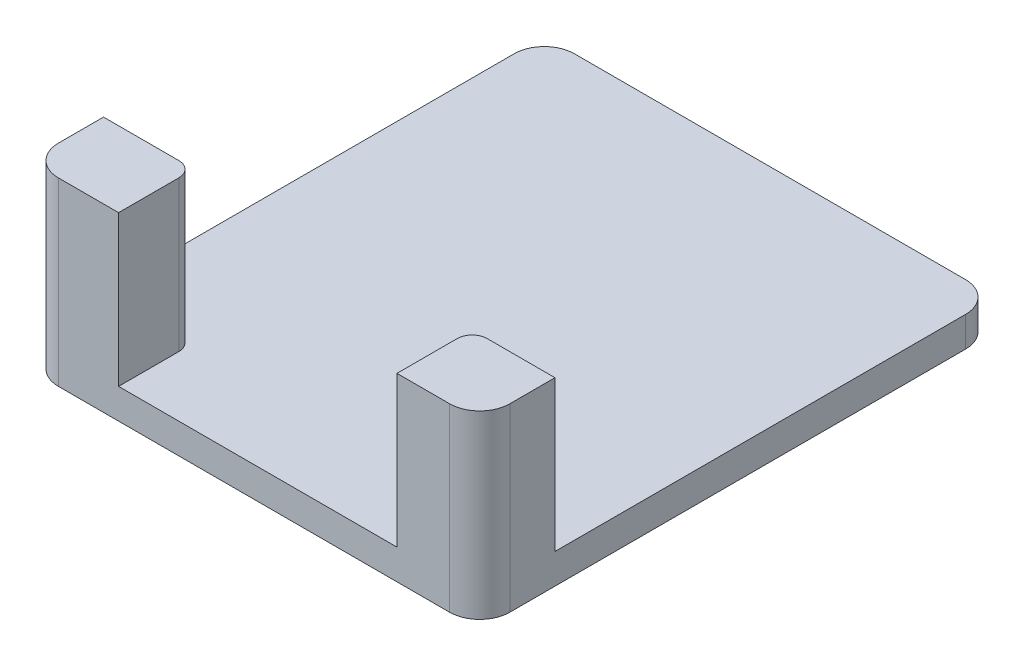
ISO-10303-21;
HEADER;
FILE_DESCRIPTION(('STEP AP214'),'2;1');
FILE_NAME('part.step','',(''),(''),'','','');
FILE_SCHEMA(('AUTOMOTIVE_DESIGN { 1 0 10303 214 1 1 1 1 }'));
ENDSEC;
DATA;
#1=APPLICATION_CONTEXT('core data for automotive mechanical design processes');
#2=APPLICATION_PROTOCOL_DEFINITION('international standard','automotive_design',2000,#1);
#3=PRODUCT_CONTEXT('',#1,'mechanical');
#4=PRODUCT('Part','Part','',(#3));
#5=PRODUCT_RELATED_PRODUCT_CATEGORY('part','',(#4));
#6=PRODUCT_DEFINITION_FORMATION('','',#4);
#7=PRODUCT_DEFINITION_CONTEXT('part definition',#1,'design');
#8=PRODUCT_DEFINITION('design','',#6,#7);
#9=PRODUCT_DEFINITION_SHAPE('','',#8);
#10=(LENGTH_UNIT() NAMED_UNIT(*) SI_UNIT(.MILLI.,.METRE.));
#11=(NAMED_UNIT(*) PLANE_ANGLE_UNIT() SI_UNIT($,.RADIAN.));
#12=(NAMED_UNIT(*) SI_UNIT($,.STERADIAN.) SOLID_ANGLE_UNIT());
#13=UNCERTAINTY_MEASURE_WITH_UNIT(LENGTH_MEASURE(1.E-05),#10,'distance_accuracy_value','');
#14=(GEOMETRIC_REPRESENTATION_CONTEXT(3) GLOBAL_UNCERTAINTY_ASSIGNED_CONTEXT((#13)) GLOBAL_UNIT_ASSIGNED_CONTEXT((#10,
#11,#12)) REPRESENTATION_CONTEXT('',''));
#15=CARTESIAN_POINT('',(0.,0.,0.));
#16=DIRECTION('',(0.,0.,1.));
#17=DIRECTION('',(1.,0.,0.));
#18=AXIS2_PLACEMENT_3D('',#15,#16,#17);
#19=CARTESIAN_POINT('',(0.,2.,0.));
#20=DIRECTION('',(0.,-1.,0.));
#21=DIRECTION('',(0.,0.,-1.));
#22=AXIS2_PLACEMENT_3D('',#19,#20,#21);
#23=PLANE('',#22);
#24=DIRECTION('',(0.,0.,-1.));
#25=VECTOR('',#24,1.);
#26=CARTESIAN_POINT('',(30.,2.,0.));
#27=LINE('',#26,#25);
#28=CARTESIAN_POINT('',(30.,2.,-5.));
#29=VERTEX_POINT('',#28);
#30=CARTESIAN_POINT('',(30.,2.,-32.29));
#31=VERTEX_POINT('',#30);
#32=EDGE_CURVE('E209',#29,#31,#27,.T.);
#33=ORIENTED_EDGE('',*,*,#32,.T.);
#34=CARTESIAN_POINT('',(28.,2.,-32.29));
#35=DIRECTION('',(0.,-1.,0.));
#36=DIRECTION('',(0.,0.,-1.));
#37=AXIS2_PLACEMENT_3D('',#34,#35,#36);
#38=CIRCLE('',#37,2.);
#39=CARTESIAN_POINT('',(28.,2.,-34.29));
#40=VERTEX_POINT('',#39);
#41=EDGE_CURVE('E244',#31,#40,#38,.F.);
#42=ORIENTED_EDGE('',*,*,#41,.T.);
#43=DIRECTION('',(-1.,0.,0.));
#44=VECTOR('',#43,1.);
#45=CARTESIAN_POINT('',(0.,2.,-34.29));
#46=LINE('',#45,#44);
#47=CARTESIAN_POINT('',(2.,2.,-34.29));
#48=VERTEX_POINT('',#47);
#49=EDGE_CURVE('E212',#40,#48,#46,.T.);
#50=ORIENTED_EDGE('',*,*,#49,.T.);
#51=CARTESIAN_POINT('',(2.,2.,-32.29));
#52=DIRECTION('',(0.,-1.,0.));
#53=DIRECTION('',(0.,0.,-1.));
#54=AXIS2_PLACEMENT_3D('',#51,#52,#53);
#55=CIRCLE('',#54,2.);
#56=CARTESIAN_POINT('',(0.,2.,-32.29));
#57=VERTEX_POINT('',#56);
#58=EDGE_CURVE('E242',#48,#57,#55,.F.);
#59=ORIENTED_EDGE('',*,*,#58,.T.);
#60=DIRECTION('',(0.,0.,1.));
#61=VECTOR('',#60,1.);
#62=CARTESIAN_POINT('',(0.,2.,0.));
#63=LINE('',#62,#61);
#64=CARTESIAN_POINT('',(0.,2.,-5.));
#65=VERTEX_POINT('',#64);
#66=EDGE_CURVE('E204',#57,#65,#63,.T.);
#67=ORIENTED_EDGE('',*,*,#66,.T.);
#68=DIRECTION('',(-1.,0.,0.));
#69=VECTOR('',#68,1.);
#70=CARTESIAN_POINT('',(0.,2.,-5.));
#71=LINE('',#70,#69);
#72=CARTESIAN_POINT('',(5.,2.,-5.));
#73=VERTEX_POINT('',#72);
#74=EDGE_CURVE('E182',#73,#65,#71,.T.);
#75=ORIENTED_EDGE('',*,*,#74,.F.);
#76=CARTESIAN_POINT('',(5.,2.,-4.));
#77=DIRECTION('',(0.,-1.,0.));
#78=DIRECTION('',(0.,0.,-1.));
#79=AXIS2_PLACEMENT_3D('',#76,#77,#78);
#80=CIRCLE('',#79,1.);
#81=CARTESIAN_POINT('',(6.,2.,-4.));
#82=VERTEX_POINT('',#81);
#83=EDGE_CURVE('E41',#73,#82,#80,.T.);
#84=ORIENTED_EDGE('',*,*,#83,.T.);
#85=DIRECTION('',(0.,0.,-1.));
#86=VECTOR('',#85,1.);
#87=CARTESIAN_POINT('',(6.,2.,0.));
#88=LINE('',#87,#86);
#89=CARTESIAN_POINT('',(6.,2.,0.));
#90=VERTEX_POINT('',#89);
#91=EDGE_CURVE('E180',#90,#82,#88,.T.);
#92=ORIENTED_EDGE('',*,*,#91,.F.);
#93=DIRECTION('',(1.,0.,0.));
#94=VECTOR('',#93,1.);
#95=CARTESIAN_POINT('',(0.,2.,0.));
#96=LINE('',#95,#94);
#97=CARTESIAN_POINT('',(24.5,2.,0.));
#98=VERTEX_POINT('',#97);
#99=EDGE_CURVE('E165',#90,#98,#96,.T.);
#100=ORIENTED_EDGE('',*,*,#99,.T.);
#101=DIRECTION('',(0.,0.,1.));
#102=VECTOR('',#101,1.);
#103=CARTESIAN_POINT('',(24.5,2.,0.));
#104=LINE('',#103,#102);
#105=CARTESIAN_POINT('',(24.5,2.,-4.));
#106=VERTEX_POINT('',#105);
#107=EDGE_CURVE('E169',#106,#98,#104,.T.);
#108=ORIENTED_EDGE('',*,*,#107,.F.);
#109=CARTESIAN_POINT('',(25.5,2.,-4.));
#110=DIRECTION('',(0.,-1.,0.));
#111=DIRECTION('',(0.,0.,-1.));
#112=AXIS2_PLACEMENT_3D('',#109,#110,#111);
#113=CIRCLE('',#112,1.);
#114=CARTESIAN_POINT('',(25.5,2.,-5.));
#115=VERTEX_POINT('',#114);
#116=EDGE_CURVE('E11',#106,#115,#113,.T.);
#117=ORIENTED_EDGE('',*,*,#116,.T.);
#118=DIRECTION('',(-1.,0.,0.));
#119=VECTOR('',#118,1.);
#120=CARTESIAN_POINT('',(24.5,2.,-5.));
#121=LINE('',#120,#119);
#122=EDGE_CURVE('E189',#29,#115,#121,.T.);
#123=ORIENTED_EDGE('',*,*,#122,.F.);
#124=EDGE_LOOP('',(#33,#42,#50,#59,#67,#75,#84,#92,#100,#108,#117,#123));
#125=FACE_BOUND('',#124,.T.);
#126=ADVANCED_FACE('F33',(#125),#23,.F.);
#127=CARTESIAN_POINT('',(0.,2.,0.));
#128=DIRECTION('',(1.,0.,0.));
#129=DIRECTION('',(0.,0.,-1.));
#130=AXIS2_PLACEMENT_3D('',#127,#128,#129);
#131=PLANE('',#130);
#132=ORIENTED_EDGE('',*,*,#66,.F.);
#133=DIRECTION('',(0.,-1.,0.));
#134=VECTOR('',#133,1.);
#135=CARTESIAN_POINT('',(0.,2.,-32.29));
#136=LINE('',#135,#134);
#137=CARTESIAN_POINT('',(0.,0.,-32.29));
#138=VERTEX_POINT('',#137);
#139=EDGE_CURVE('E248',#57,#138,#136,.T.);
#140=ORIENTED_EDGE('',*,*,#139,.T.);
#141=DIRECTION('',(0.,0.,1.));
#142=VECTOR('',#141,1.);
#143=CARTESIAN_POINT('',(0.,0.,0.));
#144=LINE('',#143,#142);
#145=CARTESIAN_POINT('',(0.,0.,-2.));
#146=VERTEX_POINT('',#145);
#147=EDGE_CURVE('E203',#138,#146,#144,.T.);
#148=ORIENTED_EDGE('',*,*,#147,.T.);
#149=DIRECTION('',(0.,-1.,0.));
#150=VECTOR('',#149,1.);
#151=CARTESIAN_POINT('',(0.,2.,-2.));
#152=LINE('',#151,#150);
#153=CARTESIAN_POINT('',(0.,12.,-2.));
#154=VERTEX_POINT('',#153);
#155=EDGE_CURVE('E246',#146,#154,#152,.F.);
#156=ORIENTED_EDGE('',*,*,#155,.T.);
#157=DIRECTION('',(0.,0.,1.));
#158=VECTOR('',#157,1.);
#159=CARTESIAN_POINT('',(0.,12.,0.));
#160=LINE('',#159,#158);
#161=CARTESIAN_POINT('',(0.,12.,-5.));
#162=VERTEX_POINT('',#161);
#163=EDGE_CURVE('E157',#162,#154,#160,.T.);
#164=ORIENTED_EDGE('',*,*,#163,.F.);
#165=DIRECTION('',(0.,-1.,0.));
#166=VECTOR('',#165,1.);
#167=CARTESIAN_POINT('',(0.,12.,-5.));
#168=LINE('',#167,#166);
#169=EDGE_CURVE('E170',#162,#65,#168,.T.);
#170=ORIENTED_EDGE('',*,*,#169,.T.);
#171=EDGE_LOOP('',(#132,#140,#148,#156,#164,#170));
#172=FACE_BOUND('',#171,.T.);
#173=ADVANCED_FACE('F280',(#172),#131,.F.);
#174=CARTESIAN_POINT('',(0.,2.,0.));
#175=DIRECTION('',(0.,0.,-1.));
#176=DIRECTION('',(-1.,0.,0.));
#177=AXIS2_PLACEMENT_3D('',#174,#175,#176);
#178=PLANE('',#177);
#179=DIRECTION('',(1.,0.,0.));
#180=VECTOR('',#179,1.);
#181=CARTESIAN_POINT('',(0.,0.,0.));
#182=LINE('',#181,#180);
#183=CARTESIAN_POINT('',(2.,0.,0.));
#184=VERTEX_POINT('',#183);
#185=CARTESIAN_POINT('',(28.,0.,0.));
#186=VERTEX_POINT('',#185);
#187=EDGE_CURVE('E218',#184,#186,#182,.T.);
#188=ORIENTED_EDGE('',*,*,#187,.T.);
#189=DIRECTION('',(0.,-1.,0.));
#190=VECTOR('',#189,1.);
#191=CARTESIAN_POINT('',(28.,2.,0.));
#192=LINE('',#191,#190);
#193=CARTESIAN_POINT('',(28.,12.,0.));
#194=VERTEX_POINT('',#193);
#195=EDGE_CURVE('E253',#186,#194,#192,.F.);
#196=ORIENTED_EDGE('',*,*,#195,.T.);
#197=DIRECTION('',(1.,0.,0.));
#198=VECTOR('',#197,1.);
#199=CARTESIAN_POINT('',(24.5,12.,0.));
#200=LINE('',#199,#198);
#201=CARTESIAN_POINT('',(24.5,12.,0.));
#202=VERTEX_POINT('',#201);
#203=EDGE_CURVE('E188',#202,#194,#200,.T.);
#204=ORIENTED_EDGE('',*,*,#203,.F.);
#205=DIRECTION('',(0.,-1.,0.));
#206=VECTOR('',#205,1.);
#207=CARTESIAN_POINT('',(24.5,12.,0.));
#208=LINE('',#207,#206);
#209=EDGE_CURVE('E201',#202,#98,#208,.T.);
#210=ORIENTED_EDGE('',*,*,#209,.T.);
#211=ORIENTED_EDGE('',*,*,#99,.F.);
#212=DIRECTION('',(0.,-1.,0.));
#213=VECTOR('',#212,1.);
#214=CARTESIAN_POINT('',(6.,12.,0.));
#215=LINE('',#214,#213);
#216=CARTESIAN_POINT('',(6.,12.,0.));
#217=VERTEX_POINT('',#216);
#218=EDGE_CURVE('E160',#217,#90,#215,.T.);
#219=ORIENTED_EDGE('',*,*,#218,.F.);
#220=DIRECTION('',(1.,0.,0.));
#221=VECTOR('',#220,1.);
#222=CARTESIAN_POINT('',(0.,12.,0.));
#223=LINE('',#222,#221);
#224=CARTESIAN_POINT('',(2.,12.,0.));
#225=VERTEX_POINT('',#224);
#226=EDGE_CURVE('E145',#225,#217,#223,.T.);
#227=ORIENTED_EDGE('',*,*,#226,.F.);
#228=DIRECTION('',(0.,-1.,0.));
#229=VECTOR('',#228,1.);
#230=CARTESIAN_POINT('',(2.,2.,0.));
#231=LINE('',#230,#229);
#232=EDGE_CURVE('E251',#225,#184,#231,.T.);
#233=ORIENTED_EDGE('',*,*,#232,.T.);
#234=EDGE_LOOP('',(#188,#196,#204,#210,#211,#219,#227,#233));
#235=FACE_BOUND('',#234,.T.);
#236=ADVANCED_FACE('F162',(#235),#178,.F.);
#237=CARTESIAN_POINT('',(30.,2.,0.));
#238=DIRECTION('',(-1.,0.,0.));
#239=DIRECTION('',(0.,0.,1.));
#240=AXIS2_PLACEMENT_3D('',#237,#238,#239);
#241=PLANE('',#240);
#242=DIRECTION('',(0.,0.,-1.));
#243=VECTOR('',#242,1.);
#244=CARTESIAN_POINT('',(30.,0.,0.));
#245=LINE('',#244,#243);
#246=CARTESIAN_POINT('',(30.,0.,-2.));
#247=VERTEX_POINT('',#246);
#248=CARTESIAN_POINT('',(30.,0.,-32.29));
#249=VERTEX_POINT('',#248);
#250=EDGE_CURVE('E220',#247,#249,#245,.T.);
#251=ORIENTED_EDGE('',*,*,#250,.T.);
#252=DIRECTION('',(0.,-1.,0.));
#253=VECTOR('',#252,1.);
#254=CARTESIAN_POINT('',(30.,2.,-32.29));
#255=LINE('',#254,#253);
#256=EDGE_CURVE('E240',#249,#31,#255,.F.);
#257=ORIENTED_EDGE('',*,*,#256,.T.);
#258=ORIENTED_EDGE('',*,*,#32,.F.);
#259=DIRECTION('',(0.,-1.,0.));
#260=VECTOR('',#259,1.);
#261=CARTESIAN_POINT('',(30.,12.,-5.));
#262=LINE('',#261,#260);
#263=CARTESIAN_POINT('',(30.,12.,-5.));
#264=VERTEX_POINT('',#263);
#265=EDGE_CURVE('E196',#264,#29,#262,.T.);
#266=ORIENTED_EDGE('',*,*,#265,.F.);
#267=DIRECTION('',(0.,0.,-1.));
#268=VECTOR('',#267,1.);
#269=CARTESIAN_POINT('',(30.,12.,0.));
#270=LINE('',#269,#268);
#271=CARTESIAN_POINT('',(30.,12.,-2.));
#272=VERTEX_POINT('',#271);
#273=EDGE_CURVE('E192',#272,#264,#270,.T.);
#274=ORIENTED_EDGE('',*,*,#273,.F.);
#275=DIRECTION('',(0.,-1.,0.));
#276=VECTOR('',#275,1.);
#277=CARTESIAN_POINT('',(30.,2.,-2.));
#278=LINE('',#277,#276);
#279=EDGE_CURVE('E237',#272,#247,#278,.T.);
#280=ORIENTED_EDGE('',*,*,#279,.T.);
#281=EDGE_LOOP('',(#251,#257,#258,#266,#274,#280));
#282=FACE_BOUND('',#281,.T.);
#283=ADVANCED_FACE('F297',(#282),#241,.F.);
#284=CARTESIAN_POINT('',(0.,2.,-34.29));
#285=DIRECTION('',(0.,0.,1.));
#286=DIRECTION('',(1.,0.,0.));
#287=AXIS2_PLACEMENT_3D('',#284,#285,#286);
#288=PLANE('',#287);
#289=ORIENTED_EDGE('',*,*,#49,.F.);
#290=DIRECTION('',(0.,-1.,0.));
#291=VECTOR('',#290,1.);
#292=CARTESIAN_POINT('',(28.,2.,-34.29));
#293=LINE('',#292,#291);
#294=CARTESIAN_POINT('',(28.,0.,-34.29));
#295=VERTEX_POINT('',#294);
#296=EDGE_CURVE('E226',#40,#295,#293,.T.);
#297=ORIENTED_EDGE('',*,*,#296,.T.);
#298=DIRECTION('',(-1.,0.,0.));
#299=VECTOR('',#298,1.);
#300=CARTESIAN_POINT('',(0.,0.,-34.29));
#301=LINE('',#300,#299);
#302=CARTESIAN_POINT('',(2.,0.,-34.29));
#303=VERTEX_POINT('',#302);
#304=EDGE_CURVE('E207',#295,#303,#301,.T.);
#305=ORIENTED_EDGE('',*,*,#304,.T.);
#306=DIRECTION('',(0.,-1.,0.));
#307=VECTOR('',#306,1.);
#308=CARTESIAN_POINT('',(2.,2.,-34.29));
#309=LINE('',#308,#307);
#310=EDGE_CURVE('E215',#303,#48,#309,.F.);
#311=ORIENTED_EDGE('',*,*,#310,.T.);
#312=EDGE_LOOP('',(#289,#297,#305,#311));
#313=FACE_BOUND('',#312,.T.);
#314=ADVANCED_FACE('F326',(#313),#288,.F.);
#315=CARTESIAN_POINT('',(0.,0.,0.));
#316=DIRECTION('',(0.,-1.,0.));
#317=DIRECTION('',(0.,0.,-1.));
#318=AXIS2_PLACEMENT_3D('',#315,#316,#317);
#319=PLANE('',#318);
#320=ORIENTED_EDGE('',*,*,#304,.F.);
#321=CARTESIAN_POINT('',(28.,0.,-32.29));
#322=DIRECTION('',(0.,-1.,0.));
#323=DIRECTION('',(0.,0.,-1.));
#324=AXIS2_PLACEMENT_3D('',#321,#322,#323);
#325=CIRCLE('',#324,2.);
#326=EDGE_CURVE('E235',#295,#249,#325,.T.);
#327=ORIENTED_EDGE('',*,*,#326,.T.);
#328=ORIENTED_EDGE('',*,*,#250,.F.);
#329=CARTESIAN_POINT('',(28.,0.,-2.));
#330=DIRECTION('',(0.,-1.,0.));
#331=DIRECTION('',(0.,0.,-1.));
#332=AXIS2_PLACEMENT_3D('',#329,#330,#331);
#333=CIRCLE('',#332,2.);
#334=EDGE_CURVE('E231',#247,#186,#333,.T.);
#335=ORIENTED_EDGE('',*,*,#334,.T.);
#336=ORIENTED_EDGE('',*,*,#187,.F.);
#337=CARTESIAN_POINT('',(2.,0.,-2.));
#338=DIRECTION('',(0.,-1.,0.));
#339=DIRECTION('',(0.,0.,-1.));
#340=AXIS2_PLACEMENT_3D('',#337,#338,#339);
#341=CIRCLE('',#340,2.);
#342=EDGE_CURVE('E229',#184,#146,#341,.T.);
#343=ORIENTED_EDGE('',*,*,#342,.T.);
#344=ORIENTED_EDGE('',*,*,#147,.F.);
#345=CARTESIAN_POINT('',(2.,0.,-32.29));
#346=DIRECTION('',(0.,-1.,0.));
#347=DIRECTION('',(0.,0.,-1.));
#348=AXIS2_PLACEMENT_3D('',#345,#346,#347);
#349=CIRCLE('',#348,2.);
#350=EDGE_CURVE('E233',#138,#303,#349,.T.);
#351=ORIENTED_EDGE('',*,*,#350,.T.);
#352=EDGE_LOOP('',(#320,#327,#328,#335,#336,#343,#344,#351));
#353=FACE_BOUND('',#352,.T.);
#354=ADVANCED_FACE('F288',(#353),#319,.T.);
#355=CARTESIAN_POINT('',(24.5,12.,0.));
#356=DIRECTION('',(1.,0.,0.));
#357=DIRECTION('',(0.,0.,-1.));
#358=AXIS2_PLACEMENT_3D('',#355,#356,#357);
#359=PLANE('',#358);
#360=DIRECTION('',(0.,0.,1.));
#361=VECTOR('',#360,1.);
#362=CARTESIAN_POINT('',(24.5,12.,0.));
#363=LINE('',#362,#361);
#364=CARTESIAN_POINT('',(24.5,12.,-4.));
#365=VERTEX_POINT('',#364);
#366=EDGE_CURVE('E186',#365,#202,#363,.T.);
#367=ORIENTED_EDGE('',*,*,#366,.F.);
#368=DIRECTION('',(0.,-1.,0.));
#369=VECTOR('',#368,1.);
#370=CARTESIAN_POINT('',(24.5,12.,-4.));
#371=LINE('',#370,#369);
#372=EDGE_CURVE('E264',#365,#106,#371,.T.);
#373=ORIENTED_EDGE('',*,*,#372,.T.);
#374=ORIENTED_EDGE('',*,*,#107,.T.);
#375=ORIENTED_EDGE('',*,*,#209,.F.);
#376=EDGE_LOOP('',(#367,#373,#374,#375));
#377=FACE_BOUND('',#376,.T.);
#378=ADVANCED_FACE('F308',(#377),#359,.F.);
#379=CARTESIAN_POINT('',(24.5,12.,-5.));
#380=DIRECTION('',(0.,0.,1.));
#381=DIRECTION('',(1.,0.,0.));
#382=AXIS2_PLACEMENT_3D('',#379,#380,#381);
#383=PLANE('',#382);
#384=ORIENTED_EDGE('',*,*,#122,.T.);
#385=DIRECTION('',(0.,-1.,0.));
#386=VECTOR('',#385,1.);
#387=CARTESIAN_POINT('',(25.5,12.,-5.));
#388=LINE('',#387,#386);
#389=CARTESIAN_POINT('',(25.5,12.,-5.));
#390=VERTEX_POINT('',#389);
#391=EDGE_CURVE('E48',#115,#390,#388,.F.);
#392=ORIENTED_EDGE('',*,*,#391,.T.);
#393=DIRECTION('',(-1.,0.,0.));
#394=VECTOR('',#393,1.);
#395=CARTESIAN_POINT('',(24.5,12.,-5.));
#396=LINE('',#395,#394);
#397=EDGE_CURVE('E194',#264,#390,#396,.T.);
#398=ORIENTED_EDGE('',*,*,#397,.F.);
#399=ORIENTED_EDGE('',*,*,#265,.T.);
#400=EDGE_LOOP('',(#384,#392,#398,#399));
#401=FACE_BOUND('',#400,.T.);
#402=ADVANCED_FACE('F391',(#401),#383,.F.);
#403=CARTESIAN_POINT('',(0.,12.,0.));
#404=DIRECTION('',(0.,-1.,0.));
#405=DIRECTION('',(0.,0.,-1.));
#406=AXIS2_PLACEMENT_3D('',#403,#404,#405);
#407=PLANE('',#406);
#408=ORIENTED_EDGE('',*,*,#397,.T.);
#409=CARTESIAN_POINT('',(25.5,12.,-4.));
#410=DIRECTION('',(0.,-1.,0.));
#411=DIRECTION('',(0.,0.,-1.));
#412=AXIS2_PLACEMENT_3D('',#409,#410,#411);
#413=CIRCLE('',#412,1.);
#414=EDGE_CURVE('E268',#390,#365,#413,.F.);
#415=ORIENTED_EDGE('',*,*,#414,.T.);
#416=ORIENTED_EDGE('',*,*,#366,.T.);
#417=ORIENTED_EDGE('',*,*,#203,.T.);
#418=CARTESIAN_POINT('',(28.,12.,-2.));
#419=DIRECTION('',(0.,-1.,0.));
#420=DIRECTION('',(0.,0.,-1.));
#421=AXIS2_PLACEMENT_3D('',#418,#419,#420);
#422=CIRCLE('',#421,2.);
#423=EDGE_CURVE('E255',#194,#272,#422,.F.);
#424=ORIENTED_EDGE('',*,*,#423,.T.);
#425=ORIENTED_EDGE('',*,*,#273,.T.);
#426=EDGE_LOOP('',(#408,#415,#416,#417,#424,#425));
#427=FACE_BOUND('',#426,.T.);
#428=ADVANCED_FACE('F302',(#427),#407,.F.);
#429=CARTESIAN_POINT('',(6.,12.,0.));
#430=DIRECTION('',(-1.,0.,0.));
#431=DIRECTION('',(0.,0.,1.));
#432=AXIS2_PLACEMENT_3D('',#429,#430,#431);
#433=PLANE('',#432);
#434=ORIENTED_EDGE('',*,*,#91,.T.);
#435=DIRECTION('',(0.,-1.,0.));
#436=VECTOR('',#435,1.);
#437=CARTESIAN_POINT('',(6.,12.,-4.));
#438=LINE('',#437,#436);
#439=CARTESIAN_POINT('',(6.,12.,-4.));
#440=VERTEX_POINT('',#439);
#441=EDGE_CURVE('E174',#82,#440,#438,.F.);
#442=ORIENTED_EDGE('',*,*,#441,.T.);
#443=DIRECTION('',(0.,0.,-1.));
#444=VECTOR('',#443,1.);
#445=CARTESIAN_POINT('',(6.,12.,0.));
#446=LINE('',#445,#444);
#447=EDGE_CURVE('E149',#217,#440,#446,.T.);
#448=ORIENTED_EDGE('',*,*,#447,.F.);
#449=ORIENTED_EDGE('',*,*,#218,.T.);
#450=EDGE_LOOP('',(#434,#442,#448,#449));
#451=FACE_BOUND('',#450,.T.);
#452=ADVANCED_FACE('F172',(#451),#433,.F.);
#453=CARTESIAN_POINT('',(0.,12.,-5.));
#454=DIRECTION('',(0.,0.,1.));
#455=DIRECTION('',(1.,0.,0.));
#456=AXIS2_PLACEMENT_3D('',#453,#454,#455);
#457=PLANE('',#456);
#458=DIRECTION('',(-1.,0.,0.));
#459=VECTOR('',#458,1.);
#460=CARTESIAN_POINT('',(0.,12.,-5.));
#461=LINE('',#460,#459);
#462=CARTESIAN_POINT('',(5.,12.,-5.));
#463=VERTEX_POINT('',#462);
#464=EDGE_CURVE('E175',#463,#162,#461,.T.);
#465=ORIENTED_EDGE('',*,*,#464,.F.);
#466=DIRECTION('',(0.,-1.,0.));
#467=VECTOR('',#466,1.);
#468=CARTESIAN_POINT('',(5.,12.,-5.));
#469=LINE('',#468,#467);
#470=EDGE_CURVE('E258',#463,#73,#469,.T.);
#471=ORIENTED_EDGE('',*,*,#470,.T.);
#472=ORIENTED_EDGE('',*,*,#74,.T.);
#473=ORIENTED_EDGE('',*,*,#169,.F.);
#474=EDGE_LOOP('',(#465,#471,#472,#473));
#475=FACE_BOUND('',#474,.T.);
#476=ADVANCED_FACE('F276',(#475),#457,.F.);
#477=CARTESIAN_POINT('',(0.,12.,0.));
#478=DIRECTION('',(0.,-1.,0.));
#479=DIRECTION('',(0.,0.,-1.));
#480=AXIS2_PLACEMENT_3D('',#477,#478,#479);
#481=PLANE('',#480);
#482=ORIENTED_EDGE('',*,*,#447,.T.);
#483=CARTESIAN_POINT('',(5.,12.,-4.));
#484=DIRECTION('',(0.,-1.,0.));
#485=DIRECTION('',(0.,0.,-1.));
#486=AXIS2_PLACEMENT_3D('',#483,#484,#485);
#487=CIRCLE('',#486,1.);
#488=EDGE_CURVE('E262',#440,#463,#487,.F.);
#489=ORIENTED_EDGE('',*,*,#488,.T.);
#490=ORIENTED_EDGE('',*,*,#464,.T.);
#491=ORIENTED_EDGE('',*,*,#163,.T.);
#492=CARTESIAN_POINT('',(2.,12.,-2.));
#493=DIRECTION('',(0.,-1.,0.));
#494=DIRECTION('',(0.,0.,-1.));
#495=AXIS2_PLACEMENT_3D('',#492,#493,#494);
#496=CIRCLE('',#495,2.);
#497=EDGE_CURVE('E153',#154,#225,#496,.F.);
#498=ORIENTED_EDGE('',*,*,#497,.T.);
#499=ORIENTED_EDGE('',*,*,#226,.T.);
#500=EDGE_LOOP('',(#482,#489,#490,#491,#498,#499));
#501=FACE_BOUND('',#500,.T.);
#502=ADVANCED_FACE('F147',(#501),#481,.F.);
#503=CARTESIAN_POINT('',(28.,2.,-32.29));
#504=DIRECTION('',(0.,-1.,0.));
#505=DIRECTION('',(0.,0.,-1.));
#506=AXIS2_PLACEMENT_3D('',#503,#504,#505);
#507=CYLINDRICAL_SURFACE('',#506,2.);
#508=ORIENTED_EDGE('',*,*,#41,.F.);
#509=ORIENTED_EDGE('',*,*,#256,.F.);
#510=ORIENTED_EDGE('',*,*,#326,.F.);
#511=ORIENTED_EDGE('',*,*,#296,.F.);
#512=EDGE_LOOP('',(#508,#509,#510,#511));
#513=FACE_BOUND('',#512,.T.);
#514=ADVANCED_FACE('F334',(#513),#507,.T.);
#515=CARTESIAN_POINT('',(2.,2.,-32.29));
#516=DIRECTION('',(0.,-1.,0.));
#517=DIRECTION('',(0.,0.,-1.));
#518=AXIS2_PLACEMENT_3D('',#515,#516,#517);
#519=CYLINDRICAL_SURFACE('',#518,2.);
#520=ORIENTED_EDGE('',*,*,#58,.F.);
#521=ORIENTED_EDGE('',*,*,#310,.F.);
#522=ORIENTED_EDGE('',*,*,#350,.F.);
#523=ORIENTED_EDGE('',*,*,#139,.F.);
#524=EDGE_LOOP('',(#520,#521,#522,#523));
#525=FACE_BOUND('',#524,.T.);
#526=ADVANCED_FACE('F337',(#525),#519,.T.);
#527=CARTESIAN_POINT('',(28.,2.,-2.));
#528=DIRECTION('',(0.,-1.,0.));
#529=DIRECTION('',(0.,0.,-1.));
#530=AXIS2_PLACEMENT_3D('',#527,#528,#529);
#531=CYLINDRICAL_SURFACE('',#530,2.);
#532=ORIENTED_EDGE('',*,*,#423,.F.);
#533=ORIENTED_EDGE('',*,*,#195,.F.);
#534=ORIENTED_EDGE('',*,*,#334,.F.);
#535=ORIENTED_EDGE('',*,*,#279,.F.);
#536=EDGE_LOOP('',(#532,#533,#534,#535));
#537=FACE_BOUND('',#536,.T.);
#538=ADVANCED_FACE('F294',(#537),#531,.T.);
#539=CARTESIAN_POINT('',(2.,2.,-2.));
#540=DIRECTION('',(0.,-1.,0.));
#541=DIRECTION('',(0.,0.,-1.));
#542=AXIS2_PLACEMENT_3D('',#539,#540,#541);
#543=CYLINDRICAL_SURFACE('',#542,2.);
#544=ORIENTED_EDGE('',*,*,#497,.F.);
#545=ORIENTED_EDGE('',*,*,#155,.F.);
#546=ORIENTED_EDGE('',*,*,#342,.F.);
#547=ORIENTED_EDGE('',*,*,#232,.F.);
#548=EDGE_LOOP('',(#544,#545,#546,#547));
#549=FACE_BOUND('',#548,.T.);
#550=ADVANCED_FACE('F283',(#549),#543,.T.);
#551=CARTESIAN_POINT('',(5.,12.,-4.));
#552=DIRECTION('',(0.,-1.,0.));
#553=DIRECTION('',(0.,0.,-1.));
#554=AXIS2_PLACEMENT_3D('',#551,#552,#553);
#555=CYLINDRICAL_SURFACE('',#554,1.);
#556=ORIENTED_EDGE('',*,*,#488,.F.);
#557=ORIENTED_EDGE('',*,*,#441,.F.);
#558=ORIENTED_EDGE('',*,*,#83,.F.);
#559=ORIENTED_EDGE('',*,*,#470,.F.);
#560=EDGE_LOOP('',(#556,#557,#558,#559));
#561=FACE_BOUND('',#560,.T.);
#562=ADVANCED_FACE('F272',(#561),#555,.T.);
#563=CARTESIAN_POINT('',(25.5,12.,-4.));
#564=DIRECTION('',(0.,-1.,0.));
#565=DIRECTION('',(0.,0.,-1.));
#566=AXIS2_PLACEMENT_3D('',#563,#564,#565);
#567=CYLINDRICAL_SURFACE('',#566,1.);
#568=ORIENTED_EDGE('',*,*,#414,.F.);
#569=ORIENTED_EDGE('',*,*,#391,.F.);
#570=ORIENTED_EDGE('',*,*,#116,.F.);
#571=ORIENTED_EDGE('',*,*,#372,.F.);
#572=EDGE_LOOP('',(#568,#569,#570,#571));
#573=FACE_BOUND('',#572,.T.);
#574=ADVANCED_FACE('F35',(#573),#567,.T.);
#575=CLOSED_SHELL('',(#126,#173,#236,#283,#314,#354,#378,#402,#428,#452,#476,#502,#514,#526,
#538,#550,#562,#574));
#576=MANIFOLD_SOLID_BREP('B2',#575);
#577=ADVANCED_BREP_SHAPE_REPRESENTATION('',(#18,#576),#14);
#578=SHAPE_DEFINITION_REPRESENTATION(#9,#577);
ENDSEC;
END-ISO-10303-21;
